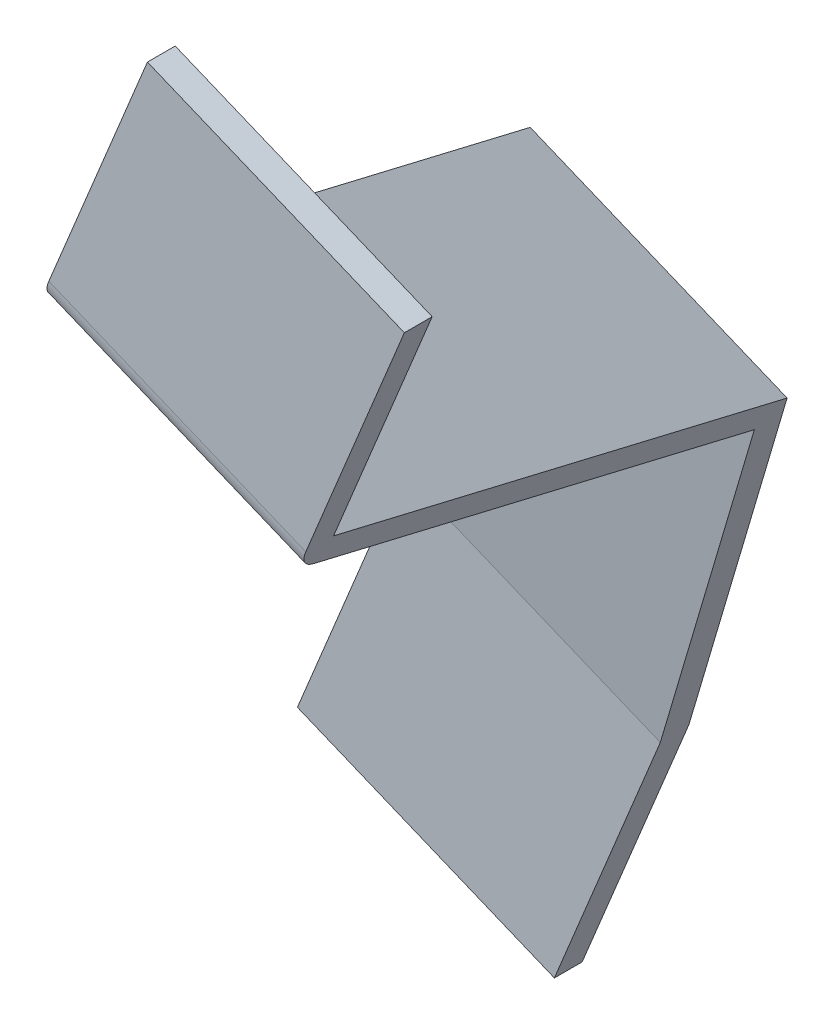
ISO-10303-21;
HEADER;
FILE_DESCRIPTION(('STEP AP214'),'2;1');
FILE_NAME('part.step','',(''),(''),'','','');
FILE_SCHEMA(('AUTOMOTIVE_DESIGN { 1 0 10303 214 1 1 1 1 }'));
ENDSEC;
DATA;
#1=APPLICATION_CONTEXT('core data for automotive mechanical design processes');
#2=APPLICATION_PROTOCOL_DEFINITION('international standard','automotive_design',2000,#1);
#3=PRODUCT_CONTEXT('',#1,'mechanical');
#4=PRODUCT('Part','Part','',(#3));
#5=PRODUCT_RELATED_PRODUCT_CATEGORY('part','',(#4));
#6=PRODUCT_DEFINITION_FORMATION('','',#4);
#7=PRODUCT_DEFINITION_CONTEXT('part definition',#1,'design');
#8=PRODUCT_DEFINITION('design','',#6,#7);
#9=PRODUCT_DEFINITION_SHAPE('','',#8);
#10=(LENGTH_UNIT() NAMED_UNIT(*) SI_UNIT(.MILLI.,.METRE.));
#11=(NAMED_UNIT(*) PLANE_ANGLE_UNIT() SI_UNIT($,.RADIAN.));
#12=(NAMED_UNIT(*) SI_UNIT($,.STERADIAN.) SOLID_ANGLE_UNIT());
#13=UNCERTAINTY_MEASURE_WITH_UNIT(LENGTH_MEASURE(1.E-05),#10,'distance_accuracy_value','');
#14=(GEOMETRIC_REPRESENTATION_CONTEXT(3) GLOBAL_UNCERTAINTY_ASSIGNED_CONTEXT((#13)) GLOBAL_UNIT_ASSIGNED_CONTEXT((#10,
#11,#12)) REPRESENTATION_CONTEXT('',''));
#15=CARTESIAN_POINT('',(0.,0.,0.));
#16=DIRECTION('',(0.,0.,1.));
#17=DIRECTION('',(1.,0.,0.));
#18=AXIS2_PLACEMENT_3D('',#15,#16,#17);
#19=CARTESIAN_POINT('',(28.502078789887,34.4482371358651,-0.306778591282021));
#20=DIRECTION('',(-0.924477403590602,0.381236842724283,0.));
#21=DIRECTION('',(-0.381236842724283,-0.924477403590602,0.));
#22=AXIS2_PLACEMENT_3D('',#19,#20,#21);
#23=CYLINDRICAL_SURFACE('',#22,0.254);
#24=CARTESIAN_POINT('',(28.502078789887,34.4482371358652,-0.306778591282021));
#25=DIRECTION('',(-0.924477403590602,0.381236842724283,0.));
#26=DIRECTION('',(-0.381236842724283,-0.924477403590602,0.));
#27=AXIS2_PLACEMENT_3D('',#24,#25,#26);
#28=CIRCLE('',#27,0.254);
#29=CARTESIAN_POINT('',(28.4113736057982,34.2282822844941,-0.21784922078064));
#30=VERTEX_POINT('',#29);
#31=CARTESIAN_POINT('',(28.502078789887,34.4482371358652,-0.0527785912820208));
#32=VERTEX_POINT('',#31);
#33=EDGE_CURVE('E132',#30,#32,#28,.T.);
#34=ORIENTED_EDGE('',*,*,#33,.T.);
#35=DIRECTION('',(-0.924477403590606,0.381236842724273,0.));
#36=VECTOR('',#35,1.);
#37=CARTESIAN_POINT('',(28.502078789887,34.4482371358652,-0.052778591282019));
#38=LINE('',#37,#36);
#39=CARTESIAN_POINT('',(26.1539061847669,35.4165787163848,-0.0527785912820207));
#40=VERTEX_POINT('',#39);
#41=EDGE_CURVE('E129',#32,#40,#38,.T.);
#42=ORIENTED_EDGE('',*,*,#41,.T.);
#43=CARTESIAN_POINT('',(26.1539061847668,35.4165787163848,-0.306778591282024));
#44=DIRECTION('',(-0.924477403590602,0.381236842724283,0.));
#45=DIRECTION('',(-0.381236842724283,-0.924477403590602,0.));
#46=AXIS2_PLACEMENT_3D('',#43,#44,#45);
#47=CIRCLE('',#46,0.254);
#48=CARTESIAN_POINT('',(26.0632010006781,35.1966238650138,-0.217849220780653));
#49=VERTEX_POINT('',#48);
#50=EDGE_CURVE('E20',#40,#49,#47,.F.);
#51=ORIENTED_EDGE('',*,*,#50,.T.);
#52=DIRECTION('',(-0.924477403590603,0.381236842724279,0.));
#53=VECTOR('',#52,1.);
#54=CARTESIAN_POINT('',(28.4113736057982,34.2282822844941,-0.217849220780631));
#55=LINE('',#54,#53);
#56=EDGE_CURVE('E126',#49,#30,#55,.F.);
#57=ORIENTED_EDGE('',*,*,#56,.T.);
#58=EDGE_LOOP('',(#34,#42,#51,#57));
#59=FACE_BOUND('',#58,.T.);
#60=ADVANCED_FACE('F17',(#59),#23,.T.);
#61=CARTESIAN_POINT('',(26.8204676167893,26.1651089180118,-3.20237859128201));
#62=DIRECTION('',(0.38123684272428,0.924477403590603,0.));
#63=DIRECTION('',(-0.924477403590603,0.38123684272428,0.));
#64=AXIS2_PLACEMENT_3D('',#61,#62,#63);
#65=PLANE('',#64);
#66=DIRECTION('',(-0.9244774035906,0.381236842724287,0.));
#67=VECTOR('',#66,1.);
#68=CARTESIAN_POINT('',(25.3383249952989,26.7763162566545,-5.48837859128202));
#69=LINE('',#68,#67);
#70=CARTESIAN_POINT('',(25.3383249952989,26.7763162566546,-5.48837859128203));
#71=VERTEX_POINT('',#70);
#72=CARTESIAN_POINT('',(22.9901523901787,27.7446578371743,-5.48837859128203));
#73=VERTEX_POINT('',#72);
#74=EDGE_CURVE('E170',#71,#73,#69,.T.);
#75=ORIENTED_EDGE('',*,*,#74,.T.);
#76=DIRECTION('',(0.,0.,1.));
#77=VECTOR('',#76,1.);
#78=CARTESIAN_POINT('',(22.9901523901787,27.7446578371743,-3.20237859128201));
#79=LINE('',#78,#77);
#80=CARTESIAN_POINT('',(22.9901523901787,27.7446578371743,-5.74237859128202));
#81=VERTEX_POINT('',#80);
#82=EDGE_CURVE('E219',#81,#73,#79,.T.);
#83=ORIENTED_EDGE('',*,*,#82,.F.);
#84=DIRECTION('',(-0.924477403590593,0.381236842724303,0.));
#85=VECTOR('',#84,1.);
#86=CARTESIAN_POINT('',(25.3383249952989,26.7763162566545,-5.74237859128202));
#87=LINE('',#86,#85);
#88=CARTESIAN_POINT('',(25.3383249952989,26.7763162566546,-5.74237859128202));
#89=VERTEX_POINT('',#88);
#90=EDGE_CURVE('E166',#89,#81,#87,.T.);
#91=ORIENTED_EDGE('',*,*,#90,.F.);
#92=DIRECTION('',(0.,0.,1.));
#93=VECTOR('',#92,1.);
#94=CARTESIAN_POINT('',(25.3383249952989,26.7763162566546,-3.20237859128201));
#95=LINE('',#94,#93);
#96=EDGE_CURVE('E216',#71,#89,#95,.F.);
#97=ORIENTED_EDGE('',*,*,#96,.F.);
#98=EDGE_LOOP('',(#75,#83,#91,#97));
#99=FACE_BOUND('',#98,.T.);
#100=ADVANCED_FACE('F264',(#99),#65,.F.);
#101=CARTESIAN_POINT('',(29.4032370996216,36.6334941756998,-0.0527785912820215));
#102=DIRECTION('',(-0.38123684272428,-0.924477403590603,0.));
#103=DIRECTION('',(0.924477403590603,-0.38123684272428,0.));
#104=AXIS2_PLACEMENT_3D('',#101,#102,#103);
#105=PLANE('',#104);
#106=DIRECTION('',(0.,0.,1.));
#107=VECTOR('',#106,1.);
#108=CARTESIAN_POINT('',(27.0550644945015,37.6018357562195,-0.306778591282022));
#109=LINE('',#108,#107);
#110=CARTESIAN_POINT('',(27.0550644945015,37.6018357562195,-0.306778591282021));
#111=VERTEX_POINT('',#110);
#112=CARTESIAN_POINT('',(27.0550644945015,37.6018357562195,-0.0527785912820206));
#113=VERTEX_POINT('',#112);
#114=EDGE_CURVE('E157',#111,#113,#109,.T.);
#115=ORIENTED_EDGE('',*,*,#114,.T.);
#116=DIRECTION('',(0.924477403590605,-0.381236842724275,0.));
#117=VECTOR('',#116,1.);
#118=CARTESIAN_POINT('',(27.0550644945014,37.6018357562195,-0.0527785912820208));
#119=LINE('',#118,#117);
#120=CARTESIAN_POINT('',(29.4032370996216,36.6334941756998,-0.0527785912820204));
#121=VERTEX_POINT('',#120);
#122=EDGE_CURVE('E141',#113,#121,#119,.T.);
#123=ORIENTED_EDGE('',*,*,#122,.T.);
#124=DIRECTION('',(0.,0.,1.));
#125=VECTOR('',#124,1.);
#126=CARTESIAN_POINT('',(29.4032370996216,36.6334941756998,-0.0527785912820215));
#127=LINE('',#126,#125);
#128=CARTESIAN_POINT('',(29.4032370996216,36.6334941756998,-0.30677859128202));
#129=VERTEX_POINT('',#128);
#130=EDGE_CURVE('E190',#129,#121,#127,.T.);
#131=ORIENTED_EDGE('',*,*,#130,.F.);
#132=DIRECTION('',(0.924477403590605,-0.381236842724275,0.));
#133=VECTOR('',#132,1.);
#134=CARTESIAN_POINT('',(27.0550644945014,37.6018357562195,-0.306778591282022));
#135=LINE('',#134,#133);
#136=EDGE_CURVE('E202',#111,#129,#135,.T.);
#137=ORIENTED_EDGE('',*,*,#136,.F.);
#138=EDGE_LOOP('',(#115,#123,#131,#137));
#139=FACE_BOUND('',#138,.T.);
#140=ADVANCED_FACE('F295',(#139),#105,.F.);
#141=CARTESIAN_POINT('',(29.8874078898815,37.8075804782599,-0.052778591282018));
#142=DIRECTION('',(0.,0.,-1.));
#143=DIRECTION('',(-1.,0.,0.));
#144=AXIS2_PLACEMENT_3D('',#141,#142,#143);
#145=PLANE('',#144);
#146=ORIENTED_EDGE('',*,*,#122,.F.);
#147=DIRECTION('',(0.381236842724279,0.924477403590603,0.));
#148=VECTOR('',#147,1.);
#149=CARTESIAN_POINT('',(26.1539061847669,35.4165787163848,-0.0527785912820205));
#150=LINE('',#149,#148);
#151=EDGE_CURVE('E148',#113,#40,#150,.F.);
#152=ORIENTED_EDGE('',*,*,#151,.T.);
#153=ORIENTED_EDGE('',*,*,#41,.F.);
#154=DIRECTION('',(0.381236842724279,0.924477403590603,0.));
#155=VECTOR('',#154,1.);
#156=CARTESIAN_POINT('',(28.502078789887,34.4482371358651,-0.0527785912820214));
#157=LINE('',#156,#155);
#158=EDGE_CURVE('E230',#121,#32,#157,.F.);
#159=ORIENTED_EDGE('',*,*,#158,.F.);
#160=EDGE_LOOP('',(#146,#152,#153,#159));
#161=FACE_BOUND('',#160,.T.);
#162=ADVANCED_FACE('F236',(#161),#145,.F.);
#163=CARTESIAN_POINT('',(28.4113736057982,34.2282822844941,-0.217849220780657));
#164=DIRECTION('',(0.357107023971488,0.865963981775742,-0.350115631895134));
#165=DIRECTION('',(-0.924477403590603,0.381236842724279,0.));
#166=AXIS2_PLACEMENT_3D('',#163,#164,#165);
#167=PLANE('',#166);
#168=DIRECTION('',(0.924477403590598,-0.381236842724291,0.));
#169=VECTOR('',#168,1.);
#170=CARTESIAN_POINT('',(25.3942932213833,33.5745609955779,-4.91206889496804));
#171=LINE('',#170,#169);
#172=CARTESIAN_POINT('',(25.3942932213833,33.5745609955779,-4.91206889496804));
#173=VERTEX_POINT('',#172);
#174=CARTESIAN_POINT('',(27.7424658265034,32.6062194150582,-4.91206889496804));
#175=VERTEX_POINT('',#174);
#176=EDGE_CURVE('E140',#173,#175,#171,.T.);
#177=ORIENTED_EDGE('',*,*,#176,.T.);
#178=DIRECTION('',(-0.133476978092113,-0.32367399033089,-0.936706487808575));
#179=VECTOR('',#178,1.);
#180=CARTESIAN_POINT('',(28.4113736057982,34.2282822844941,-0.217849220780657));
#181=LINE('',#180,#179);
#182=EDGE_CURVE('E138',#30,#175,#181,.T.);
#183=ORIENTED_EDGE('',*,*,#182,.F.);
#184=ORIENTED_EDGE('',*,*,#56,.F.);
#185=DIRECTION('',(-0.133476978092117,-0.3236739903309,-0.936706487808571));
#186=VECTOR('',#185,1.);
#187=CARTESIAN_POINT('',(26.0632010006781,35.1966238650138,-0.21784922078066));
#188=LINE('',#187,#186);
#189=EDGE_CURVE('E135',#49,#173,#188,.T.);
#190=ORIENTED_EDGE('',*,*,#189,.T.);
#191=EDGE_LOOP('',(#177,#183,#184,#190));
#192=FACE_BOUND('',#191,.T.);
#193=ADVANCED_FACE('F134',(#192),#167,.F.);
#194=CARTESIAN_POINT('',(27.7424658265034,32.6062194150582,-4.91206889496804));
#195=DIRECTION('',(0.0576667950273321,0.13983865924211,-0.988493646986487));
#196=DIRECTION('',(0.,0.990141355337797,0.140071754646792));
#197=AXIS2_PLACEMENT_3D('',#194,#195,#196);
#198=PLANE('',#197);
#199=DIRECTION('',(0.924477403590597,-0.381236842724293,0.));
#200=VECTOR('',#199,1.);
#201=CARTESIAN_POINT('',(23.9584939706984,30.0928304422944,-5.48837859128202));
#202=LINE('',#201,#200);
#203=CARTESIAN_POINT('',(23.9584939706984,30.0928304422944,-5.48837859128203));
#204=VERTEX_POINT('',#203);
#205=CARTESIAN_POINT('',(26.3066665758186,29.1244888617747,-5.48837859128203));
#206=VERTEX_POINT('',#205);
#207=EDGE_CURVE('E174',#204,#206,#202,.T.);
#208=ORIENTED_EDGE('',*,*,#207,.T.);
#209=DIRECTION('',(-0.376850197030136,-0.913840040231874,-0.151262387483982));
#210=VECTOR('',#209,1.);
#211=CARTESIAN_POINT('',(27.7424658265034,32.6062194150582,-4.91206889496804));
#212=LINE('',#211,#210);
#213=EDGE_CURVE('E177',#175,#206,#212,.T.);
#214=ORIENTED_EDGE('',*,*,#213,.F.);
#215=ORIENTED_EDGE('',*,*,#176,.F.);
#216=DIRECTION('',(-0.376850197030136,-0.913840040231874,-0.151262387483985));
#217=VECTOR('',#216,1.);
#218=CARTESIAN_POINT('',(25.3942932213833,33.5745609955779,-4.91206889496804));
#219=LINE('',#218,#217);
#220=EDGE_CURVE('E146',#173,#204,#219,.T.);
#221=ORIENTED_EDGE('',*,*,#220,.T.);
#222=EDGE_LOOP('',(#208,#214,#215,#221));
#223=FACE_BOUND('',#222,.T.);
#224=ADVANCED_FACE('F307',(#223),#198,.F.);
#225=CARTESIAN_POINT('',(26.3066665758186,29.1244888617747,-5.48837859128202));
#226=DIRECTION('',(0.,0.,-1.));
#227=DIRECTION('',(-1.,0.,0.));
#228=AXIS2_PLACEMENT_3D('',#225,#226,#227);
#229=PLANE('',#228);
#230=ORIENTED_EDGE('',*,*,#74,.F.);
#231=DIRECTION('',(0.381236842724279,0.924477403590603,0.));
#232=VECTOR('',#231,1.);
#233=CARTESIAN_POINT('',(28.502078789887,34.4482371358651,-5.48837859128202));
#234=LINE('',#233,#232);
#235=EDGE_CURVE('E181',#206,#71,#234,.F.);
#236=ORIENTED_EDGE('',*,*,#235,.F.);
#237=ORIENTED_EDGE('',*,*,#207,.F.);
#238=DIRECTION('',(0.381236842724279,0.924477403590603,0.));
#239=VECTOR('',#238,1.);
#240=CARTESIAN_POINT('',(26.1539061847669,35.4165787163848,-5.48837859128203));
#241=LINE('',#240,#239);
#242=EDGE_CURVE('E154',#204,#73,#241,.F.);
#243=ORIENTED_EDGE('',*,*,#242,.T.);
#244=EDGE_LOOP('',(#230,#236,#237,#243));
#245=FACE_BOUND('',#244,.T.);
#246=ADVANCED_FACE('F259',(#245),#229,.F.);
#247=CARTESIAN_POINT('',(26.3066665758186,29.1244888617748,-5.74237859128202));
#248=DIRECTION('',(0.,0.,-1.));
#249=DIRECTION('',(-1.,0.,0.));
#250=AXIS2_PLACEMENT_3D('',#247,#248,#249);
#251=PLANE('',#250);
#252=DIRECTION('',(-0.924477403590608,0.381236842724268,0.));
#253=VECTOR('',#252,1.);
#254=CARTESIAN_POINT('',(26.3140326370374,29.1423511363168,-5.74237859128203));
#255=LINE('',#254,#253);
#256=CARTESIAN_POINT('',(26.3140326370374,29.1423511363168,-5.74237859128202));
#257=VERTEX_POINT('',#256);
#258=CARTESIAN_POINT('',(23.9658600319173,30.1106927168364,-5.74237859128203));
#259=VERTEX_POINT('',#258);
#260=EDGE_CURVE('E275',#257,#259,#255,.T.);
#261=ORIENTED_EDGE('',*,*,#260,.F.);
#262=DIRECTION('',(0.381236842724279,0.924477403590603,0.));
#263=VECTOR('',#262,1.);
#264=CARTESIAN_POINT('',(28.502078789887,34.4482371358651,-5.74237859128202));
#265=LINE('',#264,#263);
#266=EDGE_CURVE('E213',#89,#257,#265,.T.);
#267=ORIENTED_EDGE('',*,*,#266,.F.);
#268=ORIENTED_EDGE('',*,*,#90,.T.);
#269=DIRECTION('',(0.381236842724279,0.924477403590603,0.));
#270=VECTOR('',#269,1.);
#271=CARTESIAN_POINT('',(26.1539061847669,35.4165787163848,-5.74237859128203));
#272=LINE('',#271,#270);
#273=EDGE_CURVE('E207',#81,#259,#272,.T.);
#274=ORIENTED_EDGE('',*,*,#273,.T.);
#275=EDGE_LOOP('',(#261,#267,#268,#274));
#276=FACE_BOUND('',#275,.T.);
#277=ADVANCED_FACE('F298',(#276),#251,.T.);
#278=CARTESIAN_POINT('',(26.1539061847669,35.4165787163848,-0.306778591282022));
#279=DIRECTION('',(0.924477403590603,-0.381236842724279,0.));
#280=DIRECTION('',(0.381236842724279,0.924477403590603,0.));
#281=AXIS2_PLACEMENT_3D('',#278,#279,#280);
#282=PLANE('',#281);
#283=ORIENTED_EDGE('',*,*,#82,.T.);
#284=ORIENTED_EDGE('',*,*,#242,.F.);
#285=ORIENTED_EDGE('',*,*,#220,.F.);
#286=ORIENTED_EDGE('',*,*,#189,.F.);
#287=ORIENTED_EDGE('',*,*,#50,.F.);
#288=ORIENTED_EDGE('',*,*,#151,.F.);
#289=ORIENTED_EDGE('',*,*,#114,.F.);
#290=DIRECTION('',(0.381236842724266,0.924477403590609,0.));
#291=VECTOR('',#290,1.);
#292=CARTESIAN_POINT('',(26.1539061847669,35.4165787163848,-0.306778591282022));
#293=LINE('',#292,#291);
#294=CARTESIAN_POINT('',(26.1539061847669,35.4165787163848,-0.306778591282024));
#295=VERTEX_POINT('',#294);
#296=EDGE_CURVE('E206',#295,#111,#293,.T.);
#297=ORIENTED_EDGE('',*,*,#296,.F.);
#298=DIRECTION('',(0.133476978092117,0.323673990330897,0.936706487808572));
#299=VECTOR('',#298,1.);
#300=CARTESIAN_POINT('',(26.1539061847669,35.4165787163848,-0.306778591282021));
#301=LINE('',#300,#299);
#302=CARTESIAN_POINT('',(25.4651053481902,33.7462763278773,-5.14060253344574));
#303=VERTEX_POINT('',#302);
#304=EDGE_CURVE('E279',#303,#295,#301,.T.);
#305=ORIENTED_EDGE('',*,*,#304,.F.);
#306=DIRECTION('',(0.376850197030141,0.913840040231872,0.151262387483985));
#307=VECTOR('',#306,1.);
#308=CARTESIAN_POINT('',(23.9658600319172,30.1106927168364,-5.74237859128204));
#309=LINE('',#308,#307);
#310=EDGE_CURVE('E268',#259,#303,#309,.T.);
#311=ORIENTED_EDGE('',*,*,#310,.F.);
#312=ORIENTED_EDGE('',*,*,#273,.F.);
#313=EDGE_LOOP('',(#283,#284,#285,#286,#287,#288,#289,#297,#305,#311,#312));
#314=FACE_BOUND('',#313,.T.);
#315=ADVANCED_FACE('F144',(#314),#282,.F.);
#316=CARTESIAN_POINT('',(29.8874078898814,37.8075804782599,-0.306778591282019));
#317=DIRECTION('',(0.,0.,-1.));
#318=DIRECTION('',(-1.,0.,0.));
#319=AXIS2_PLACEMENT_3D('',#316,#317,#318);
#320=PLANE('',#319);
#321=DIRECTION('',(-0.924477403590603,0.381236842724279,0.));
#322=VECTOR('',#321,1.);
#323=CARTESIAN_POINT('',(28.502078789887,34.4482371358651,-0.30677859128203));
#324=LINE('',#323,#322);
#325=CARTESIAN_POINT('',(28.502078789887,34.4482371358651,-0.306778591282023));
#326=VERTEX_POINT('',#325);
#327=EDGE_CURVE('E282',#295,#326,#324,.F.);
#328=ORIENTED_EDGE('',*,*,#327,.F.);
#329=ORIENTED_EDGE('',*,*,#296,.T.);
#330=ORIENTED_EDGE('',*,*,#136,.T.);
#331=DIRECTION('',(0.381236842724279,0.924477403590603,0.));
#332=VECTOR('',#331,1.);
#333=CARTESIAN_POINT('',(28.502078789887,34.4482371358651,-0.306778591282021));
#334=LINE('',#333,#332);
#335=EDGE_CURVE('E226',#326,#129,#334,.T.);
#336=ORIENTED_EDGE('',*,*,#335,.F.);
#337=EDGE_LOOP('',(#328,#329,#330,#336));
#338=FACE_BOUND('',#337,.T.);
#339=ADVANCED_FACE('F292',(#338),#320,.T.);
#340=CARTESIAN_POINT('',(28.502078789887,34.4482371358651,-0.306778591282021));
#341=DIRECTION('',(0.924477403590603,-0.381236842724279,0.));
#342=DIRECTION('',(0.381236842724279,0.924477403590603,0.));
#343=AXIS2_PLACEMENT_3D('',#340,#341,#342);
#344=PLANE('',#343);
#345=ORIENTED_EDGE('',*,*,#213,.T.);
#346=ORIENTED_EDGE('',*,*,#235,.T.);
#347=ORIENTED_EDGE('',*,*,#96,.T.);
#348=ORIENTED_EDGE('',*,*,#266,.T.);
#349=DIRECTION('',(-0.376850197030147,-0.913840040231869,-0.151262387483985));
#350=VECTOR('',#349,1.);
#351=CARTESIAN_POINT('',(27.8132779533103,32.7779347473576,-5.14060253344574));
#352=LINE('',#351,#350);
#353=CARTESIAN_POINT('',(27.8132779533103,32.7779347473576,-5.14060253344574));
#354=VERTEX_POINT('',#353);
#355=EDGE_CURVE('E40',#354,#257,#352,.T.);
#356=ORIENTED_EDGE('',*,*,#355,.F.);
#357=DIRECTION('',(0.133476978092117,0.323673990330897,0.936706487808572));
#358=VECTOR('',#357,1.);
#359=CARTESIAN_POINT('',(28.502078789887,34.4482371358651,-0.306778591282021));
#360=LINE('',#359,#358);
#361=EDGE_CURVE('E27',#326,#354,#360,.F.);
#362=ORIENTED_EDGE('',*,*,#361,.F.);
#363=ORIENTED_EDGE('',*,*,#335,.T.);
#364=ORIENTED_EDGE('',*,*,#130,.T.);
#365=ORIENTED_EDGE('',*,*,#158,.T.);
#366=ORIENTED_EDGE('',*,*,#33,.F.);
#367=ORIENTED_EDGE('',*,*,#182,.T.);
#368=EDGE_LOOP('',(#345,#346,#347,#348,#356,#362,#363,#364,#365,#366,#367));
#369=FACE_BOUND('',#368,.T.);
#370=ADVANCED_FACE('F237',(#369),#344,.T.);
#371=CARTESIAN_POINT('',(27.7571131924404,32.6417384345057,-5.16314628130261));
#372=DIRECTION('',(0.0576667950273321,0.13983865924211,-0.988493646986487));
#373=DIRECTION('',(0.,0.990141355337797,0.140071754646792));
#374=AXIS2_PLACEMENT_3D('',#371,#372,#373);
#375=PLANE('',#374);
#376=ORIENTED_EDGE('',*,*,#355,.T.);
#377=ORIENTED_EDGE('',*,*,#260,.T.);
#378=ORIENTED_EDGE('',*,*,#310,.T.);
#379=DIRECTION('',(-0.924477403590603,0.381236842724279,0.));
#380=VECTOR('',#379,1.);
#381=CARTESIAN_POINT('',(27.8132779533103,32.7779347473576,-5.14060253344575));
#382=LINE('',#381,#380);
#383=EDGE_CURVE('E11',#354,#303,#382,.T.);
#384=ORIENTED_EDGE('',*,*,#383,.F.);
#385=EDGE_LOOP('',(#376,#377,#378,#384));
#386=FACE_BOUND('',#385,.T.);
#387=ADVANCED_FACE('F297',(#386),#375,.T.);
#388=CARTESIAN_POINT('',(28.502078789887,34.4482371358651,-0.306778591282021));
#389=DIRECTION('',(0.357107023971489,0.865963981775742,-0.350115631895134));
#390=DIRECTION('',(-0.924477403590603,0.381236842724279,0.));
#391=AXIS2_PLACEMENT_3D('',#388,#389,#390);
#392=PLANE('',#391);
#393=ORIENTED_EDGE('',*,*,#361,.T.);
#394=ORIENTED_EDGE('',*,*,#383,.T.);
#395=ORIENTED_EDGE('',*,*,#304,.T.);
#396=ORIENTED_EDGE('',*,*,#327,.T.);
#397=EDGE_LOOP('',(#393,#394,#395,#396));
#398=FACE_BOUND('',#397,.T.);
#399=ADVANCED_FACE('F289',(#398),#392,.T.);
#400=CLOSED_SHELL('',(#60,#100,#140,#162,#193,#224,#246,#277,#315,#339,#370,#387,#399));
#401=MANIFOLD_SOLID_BREP('B1',#400);
#402=ADVANCED_BREP_SHAPE_REPRESENTATION('',(#18,#401),#14);
#403=SHAPE_DEFINITION_REPRESENTATION(#9,#402);
ENDSEC;
END-ISO-10303-21;
